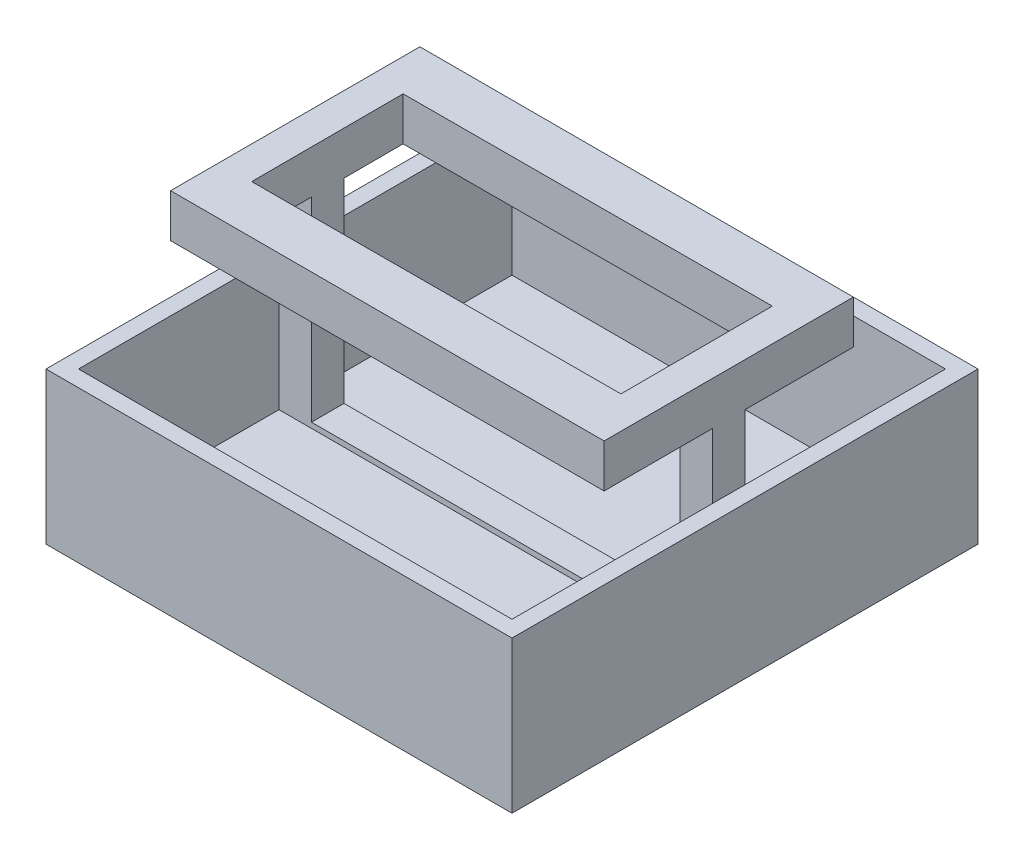
ISO-10303-21;
HEADER;
FILE_DESCRIPTION(('STEP AP214'),'2;1');
FILE_NAME('part.step','',(''),(''),'','','');
FILE_SCHEMA(('AUTOMOTIVE_DESIGN { 1 0 10303 214 1 1 1 1 }'));
ENDSEC;
DATA;
#1=APPLICATION_CONTEXT('core data for automotive mechanical design processes');
#2=APPLICATION_PROTOCOL_DEFINITION('international standard','automotive_design',2000,#1);
#3=PRODUCT_CONTEXT('',#1,'mechanical');
#4=PRODUCT('Part','Part','',(#3));
#5=PRODUCT_RELATED_PRODUCT_CATEGORY('part','',(#4));
#6=PRODUCT_DEFINITION_FORMATION('','',#4);
#7=PRODUCT_DEFINITION_CONTEXT('part definition',#1,'design');
#8=PRODUCT_DEFINITION('design','',#6,#7);
#9=PRODUCT_DEFINITION_SHAPE('','',#8);
#10=(LENGTH_UNIT() NAMED_UNIT(*) SI_UNIT(.MILLI.,.METRE.));
#11=(NAMED_UNIT(*) PLANE_ANGLE_UNIT() SI_UNIT($,.RADIAN.));
#12=(NAMED_UNIT(*) SI_UNIT($,.STERADIAN.) SOLID_ANGLE_UNIT());
#13=UNCERTAINTY_MEASURE_WITH_UNIT(LENGTH_MEASURE(1.E-05),#10,'distance_accuracy_value','');
#14=(GEOMETRIC_REPRESENTATION_CONTEXT(3) GLOBAL_UNCERTAINTY_ASSIGNED_CONTEXT((#13)) GLOBAL_UNIT_ASSIGNED_CONTEXT((#10,
#11,#12)) REPRESENTATION_CONTEXT('',''));
#15=CARTESIAN_POINT('',(0.,0.,0.));
#16=DIRECTION('',(0.,0.,1.));
#17=DIRECTION('',(1.,0.,0.));
#18=AXIS2_PLACEMENT_3D('',#15,#16,#17);
#19=CARTESIAN_POINT('',(10.,7.,0.));
#20=DIRECTION('',(1.,0.,0.));
#21=DIRECTION('',(0.,0.,-1.));
#22=AXIS2_PLACEMENT_3D('',#19,#20,#21);
#23=PLANE('',#22);
#24=DIRECTION('',(0.,-1.,0.));
#25=VECTOR('',#24,1.);
#26=CARTESIAN_POINT('',(10.,12.,0.75));
#27=LINE('',#26,#25);
#28=CARTESIAN_POINT('',(10.,7.,0.75));
#29=VERTEX_POINT('',#28);
#30=CARTESIAN_POINT('',(10.,0.75,0.75));
#31=VERTEX_POINT('',#30);
#32=EDGE_CURVE('E304',#29,#31,#27,.T.);
#33=ORIENTED_EDGE('',*,*,#32,.T.);
#34=DIRECTION('',(0.,0.,1.));
#35=VECTOR('',#34,1.);
#36=CARTESIAN_POINT('',(10.,0.75,0.));
#37=LINE('',#36,#35);
#38=CARTESIAN_POINT('',(10.,0.75,10.));
#39=VERTEX_POINT('',#38);
#40=EDGE_CURVE('E316',#31,#39,#37,.T.);
#41=ORIENTED_EDGE('',*,*,#40,.T.);
#42=DIRECTION('',(0.,-1.,0.));
#43=VECTOR('',#42,1.);
#44=CARTESIAN_POINT('',(10.,7.,10.));
#45=LINE('',#44,#43);
#46=CARTESIAN_POINT('',(10.,7.,10.));
#47=VERTEX_POINT('',#46);
#48=EDGE_CURVE('E371',#47,#39,#45,.T.);
#49=ORIENTED_EDGE('',*,*,#48,.F.);
#50=DIRECTION('',(0.,0.,1.));
#51=VECTOR('',#50,1.);
#52=CARTESIAN_POINT('',(10.,7.,0.));
#53=LINE('',#52,#51);
#54=EDGE_CURVE('E343',#29,#47,#53,.T.);
#55=ORIENTED_EDGE('',*,*,#54,.F.);
#56=EDGE_LOOP('',(#33,#41,#49,#55));
#57=FACE_BOUND('',#56,.T.);
#58=ADVANCED_FACE('F39',(#57),#23,.F.);
#59=CARTESIAN_POINT('',(-9.99999999999999,7.,0.));
#60=DIRECTION('',(1.,0.,0.));
#61=DIRECTION('',(0.,0.,-1.));
#62=AXIS2_PLACEMENT_3D('',#59,#60,#61);
#63=PLANE('',#62);
#64=DIRECTION('',(0.,0.,1.));
#65=VECTOR('',#64,1.);
#66=CARTESIAN_POINT('',(-9.99999999999999,0.75,0.));
#67=LINE('',#66,#65);
#68=CARTESIAN_POINT('',(-9.99999999999999,0.75,0.75));
#69=VERTEX_POINT('',#68);
#70=CARTESIAN_POINT('',(-9.99999999999999,0.75,10.));
#71=VERTEX_POINT('',#70);
#72=EDGE_CURVE('E322',#69,#71,#67,.T.);
#73=ORIENTED_EDGE('',*,*,#72,.F.);
#74=DIRECTION('',(0.,-1.,0.));
#75=VECTOR('',#74,1.);
#76=CARTESIAN_POINT('',(-9.99999999999999,12.,0.75));
#77=LINE('',#76,#75);
#78=CARTESIAN_POINT('',(-9.99999999999999,7.,0.75));
#79=VERTEX_POINT('',#78);
#80=EDGE_CURVE('E307',#79,#69,#77,.T.);
#81=ORIENTED_EDGE('',*,*,#80,.F.);
#82=DIRECTION('',(0.,0.,1.));
#83=VECTOR('',#82,1.);
#84=CARTESIAN_POINT('',(-9.99999999999999,7.,0.));
#85=LINE('',#84,#83);
#86=CARTESIAN_POINT('',(-9.99999999999999,7.,10.));
#87=VERTEX_POINT('',#86);
#88=EDGE_CURVE('E350',#79,#87,#85,.T.);
#89=ORIENTED_EDGE('',*,*,#88,.T.);
#90=DIRECTION('',(0.,-1.,0.));
#91=VECTOR('',#90,1.);
#92=CARTESIAN_POINT('',(-9.99999999999999,7.,10.));
#93=LINE('',#92,#91);
#94=EDGE_CURVE('E367',#87,#71,#93,.T.);
#95=ORIENTED_EDGE('',*,*,#94,.T.);
#96=EDGE_LOOP('',(#73,#81,#89,#95));
#97=FACE_BOUND('',#96,.T.);
#98=ADVANCED_FACE('F440',(#97),#63,.T.);
#99=CARTESIAN_POINT('',(0.,0.75,0.));
#100=DIRECTION('',(0.,1.,0.));
#101=DIRECTION('',(0.,0.,1.));
#102=AXIS2_PLACEMENT_3D('',#99,#100,#101);
#103=PLANE('',#102);
#104=ORIENTED_EDGE('',*,*,#40,.F.);
#105=DIRECTION('',(-1.,0.,0.));
#106=VECTOR('',#105,1.);
#107=CARTESIAN_POINT('',(0.,0.75,0.75));
#108=LINE('',#107,#106);
#109=EDGE_CURVE('E387',#31,#69,#108,.T.);
#110=ORIENTED_EDGE('',*,*,#109,.T.);
#111=ORIENTED_EDGE('',*,*,#72,.T.);
#112=DIRECTION('',(1.,0.,0.));
#113=VECTOR('',#112,1.);
#114=CARTESIAN_POINT('',(0.,0.75,10.));
#115=LINE('',#114,#113);
#116=EDGE_CURVE('E325',#71,#39,#115,.T.);
#117=ORIENTED_EDGE('',*,*,#116,.T.);
#118=EDGE_LOOP('',(#104,#110,#111,#117));
#119=FACE_BOUND('',#118,.T.);
#120=ADVANCED_FACE('F454',(#119),#103,.T.);
#121=CARTESIAN_POINT('',(0.,7.,-10.));
#122=DIRECTION('',(0.,0.,-1.));
#123=DIRECTION('',(-1.,0.,0.));
#124=AXIS2_PLACEMENT_3D('',#121,#122,#123);
#125=PLANE('',#124);
#126=DIRECTION('',(0.,-1.,0.));
#127=VECTOR('',#126,1.);
#128=CARTESIAN_POINT('',(-9.99999999999999,7.,-10.));
#129=LINE('',#128,#127);
#130=CARTESIAN_POINT('',(-9.99999999999999,7.,-10.));
#131=VERTEX_POINT('',#130);
#132=CARTESIAN_POINT('',(-9.99999999999999,0.75,-10.));
#133=VERTEX_POINT('',#132);
#134=EDGE_CURVE('E364',#131,#133,#129,.T.);
#135=ORIENTED_EDGE('',*,*,#134,.T.);
#136=DIRECTION('',(1.,0.,0.));
#137=VECTOR('',#136,1.);
#138=CARTESIAN_POINT('',(0.,0.75,-10.));
#139=LINE('',#138,#137);
#140=CARTESIAN_POINT('',(10.,0.75,-10.));
#141=VERTEX_POINT('',#140);
#142=EDGE_CURVE('E320',#133,#141,#139,.T.);
#143=ORIENTED_EDGE('',*,*,#142,.T.);
#144=DIRECTION('',(0.,-1.,0.));
#145=VECTOR('',#144,1.);
#146=CARTESIAN_POINT('',(10.,7.,-10.));
#147=LINE('',#146,#145);
#148=CARTESIAN_POINT('',(10.,7.,-10.));
#149=VERTEX_POINT('',#148);
#150=EDGE_CURVE('E374',#149,#141,#147,.T.);
#151=ORIENTED_EDGE('',*,*,#150,.F.);
#152=DIRECTION('',(1.,0.,0.));
#153=VECTOR('',#152,1.);
#154=CARTESIAN_POINT('',(0.,7.,-10.));
#155=LINE('',#154,#153);
#156=EDGE_CURVE('E340',#131,#149,#155,.T.);
#157=ORIENTED_EDGE('',*,*,#156,.F.);
#158=EDGE_LOOP('',(#135,#143,#151,#157));
#159=FACE_BOUND('',#158,.T.);
#160=ADVANCED_FACE('F480',(#159),#125,.F.);
#161=CARTESIAN_POINT('',(10.,0.75,-0.75));
#162=VERTEX_POINT('',#161);
#163=EDGE_CURVE('E317',#141,#162,#37,.T.);
#164=ORIENTED_EDGE('',*,*,#163,.T.);
#165=DIRECTION('',(0.,-1.,0.));
#166=VECTOR('',#165,1.);
#167=CARTESIAN_POINT('',(10.,12.,-0.75));
#168=LINE('',#167,#166);
#169=CARTESIAN_POINT('',(10.,7.,-0.75));
#170=VERTEX_POINT('',#169);
#171=EDGE_CURVE('E301',#170,#162,#168,.T.);
#172=ORIENTED_EDGE('',*,*,#171,.F.);
#173=EDGE_CURVE('E344',#149,#170,#53,.T.);
#174=ORIENTED_EDGE('',*,*,#173,.F.);
#175=ORIENTED_EDGE('',*,*,#150,.T.);
#176=EDGE_LOOP('',(#164,#172,#174,#175));
#177=FACE_BOUND('',#176,.T.);
#178=ADVANCED_FACE('F484',(#177),#23,.F.);
#179=CARTESIAN_POINT('',(0.,7.,10.));
#180=DIRECTION('',(0.,0.,-1.));
#181=DIRECTION('',(-1.,0.,0.));
#182=AXIS2_PLACEMENT_3D('',#179,#180,#181);
#183=PLANE('',#182);
#184=ORIENTED_EDGE('',*,*,#116,.F.);
#185=ORIENTED_EDGE('',*,*,#94,.F.);
#186=DIRECTION('',(1.,0.,0.));
#187=VECTOR('',#186,1.);
#188=CARTESIAN_POINT('',(0.,7.,10.));
#189=LINE('',#188,#187);
#190=EDGE_CURVE('E347',#87,#47,#189,.T.);
#191=ORIENTED_EDGE('',*,*,#190,.T.);
#192=ORIENTED_EDGE('',*,*,#48,.T.);
#193=EDGE_LOOP('',(#184,#185,#191,#192));
#194=FACE_BOUND('',#193,.T.);
#195=ADVANCED_FACE('F451',(#194),#183,.T.);
#196=CARTESIAN_POINT('',(0.,7.,-10.75));
#197=DIRECTION('',(0.,0.,-1.));
#198=DIRECTION('',(-1.,0.,0.));
#199=AXIS2_PLACEMENT_3D('',#196,#197,#198);
#200=PLANE('',#199);
#201=DIRECTION('',(1.,0.,0.));
#202=VECTOR('',#201,1.);
#203=CARTESIAN_POINT('',(0.,0.,-10.75));
#204=LINE('',#203,#202);
#205=CARTESIAN_POINT('',(-10.75,0.,-10.75));
#206=VERTEX_POINT('',#205);
#207=CARTESIAN_POINT('',(10.75,0.,-10.75));
#208=VERTEX_POINT('',#207);
#209=EDGE_CURVE('E328',#206,#208,#204,.T.);
#210=ORIENTED_EDGE('',*,*,#209,.F.);
#211=DIRECTION('',(0.,-1.,0.));
#212=VECTOR('',#211,1.);
#213=CARTESIAN_POINT('',(-10.75,7.,-10.75));
#214=LINE('',#213,#212);
#215=CARTESIAN_POINT('',(-10.75,7.,-10.75));
#216=VERTEX_POINT('',#215);
#217=EDGE_CURVE('E368',#216,#206,#214,.T.);
#218=ORIENTED_EDGE('',*,*,#217,.F.);
#219=DIRECTION('',(1.,0.,0.));
#220=VECTOR('',#219,1.);
#221=CARTESIAN_POINT('',(0.,7.,-10.75));
#222=LINE('',#221,#220);
#223=CARTESIAN_POINT('',(10.75,7.,-10.75));
#224=VERTEX_POINT('',#223);
#225=EDGE_CURVE('E329',#216,#224,#222,.T.);
#226=ORIENTED_EDGE('',*,*,#225,.T.);
#227=DIRECTION('',(0.,-1.,0.));
#228=VECTOR('',#227,1.);
#229=CARTESIAN_POINT('',(10.75,7.,-10.75));
#230=LINE('',#229,#228);
#231=EDGE_CURVE('E354',#224,#208,#230,.T.);
#232=ORIENTED_EDGE('',*,*,#231,.T.);
#233=EDGE_LOOP('',(#210,#218,#226,#232));
#234=FACE_BOUND('',#233,.T.);
#235=ADVANCED_FACE('F41',(#234),#200,.T.);
#236=CARTESIAN_POINT('',(-10.75,7.,0.));
#237=DIRECTION('',(1.,0.,0.));
#238=DIRECTION('',(0.,0.,-1.));
#239=AXIS2_PLACEMENT_3D('',#236,#237,#238);
#240=PLANE('',#239);
#241=DIRECTION('',(0.,0.,1.));
#242=VECTOR('',#241,1.);
#243=CARTESIAN_POINT('',(-10.75,0.,0.));
#244=LINE('',#243,#242);
#245=CARTESIAN_POINT('',(-10.75,0.,10.75));
#246=VERTEX_POINT('',#245);
#247=EDGE_CURVE('E357',#206,#246,#244,.T.);
#248=ORIENTED_EDGE('',*,*,#247,.T.);
#249=DIRECTION('',(0.,-1.,0.));
#250=VECTOR('',#249,1.);
#251=CARTESIAN_POINT('',(-10.75,7.,10.75));
#252=LINE('',#251,#250);
#253=CARTESIAN_POINT('',(-10.75,7.,10.75));
#254=VERTEX_POINT('',#253);
#255=EDGE_CURVE('E381',#254,#246,#252,.T.);
#256=ORIENTED_EDGE('',*,*,#255,.F.);
#257=DIRECTION('',(0.,0.,1.));
#258=VECTOR('',#257,1.);
#259=CARTESIAN_POINT('',(-10.75,7.,0.));
#260=LINE('',#259,#258);
#261=EDGE_CURVE('E332',#216,#254,#260,.T.);
#262=ORIENTED_EDGE('',*,*,#261,.F.);
#263=ORIENTED_EDGE('',*,*,#217,.T.);
#264=EDGE_LOOP('',(#248,#256,#262,#263));
#265=FACE_BOUND('',#264,.T.);
#266=ADVANCED_FACE('F522',(#265),#240,.F.);
#267=CARTESIAN_POINT('',(0.,7.,10.75));
#268=DIRECTION('',(0.,0.,-1.));
#269=DIRECTION('',(-1.,0.,0.));
#270=AXIS2_PLACEMENT_3D('',#267,#268,#269);
#271=PLANE('',#270);
#272=DIRECTION('',(1.,0.,0.));
#273=VECTOR('',#272,1.);
#274=CARTESIAN_POINT('',(0.,0.,10.75));
#275=LINE('',#274,#273);
#276=CARTESIAN_POINT('',(10.75,0.,10.75));
#277=VERTEX_POINT('',#276);
#278=EDGE_CURVE('E359',#246,#277,#275,.T.);
#279=ORIENTED_EDGE('',*,*,#278,.T.);
#280=DIRECTION('',(0.,-1.,0.));
#281=VECTOR('',#280,1.);
#282=CARTESIAN_POINT('',(10.75,7.,10.75));
#283=LINE('',#282,#281);
#284=CARTESIAN_POINT('',(10.75,7.,10.75));
#285=VERTEX_POINT('',#284);
#286=EDGE_CURVE('E379',#285,#277,#283,.T.);
#287=ORIENTED_EDGE('',*,*,#286,.F.);
#288=DIRECTION('',(1.,0.,0.));
#289=VECTOR('',#288,1.);
#290=CARTESIAN_POINT('',(0.,7.,10.75));
#291=LINE('',#290,#289);
#292=EDGE_CURVE('E335',#254,#285,#291,.T.);
#293=ORIENTED_EDGE('',*,*,#292,.F.);
#294=ORIENTED_EDGE('',*,*,#255,.T.);
#295=EDGE_LOOP('',(#279,#287,#293,#294));
#296=FACE_BOUND('',#295,.T.);
#297=ADVANCED_FACE('F519',(#296),#271,.F.);
#298=CARTESIAN_POINT('',(10.75,7.,0.));
#299=DIRECTION('',(1.,0.,0.));
#300=DIRECTION('',(0.,0.,-1.));
#301=AXIS2_PLACEMENT_3D('',#298,#299,#300);
#302=PLANE('',#301);
#303=DIRECTION('',(0.,0.,1.));
#304=VECTOR('',#303,1.);
#305=CARTESIAN_POINT('',(10.75,0.,0.));
#306=LINE('',#305,#304);
#307=EDGE_CURVE('E333',#208,#277,#306,.T.);
#308=ORIENTED_EDGE('',*,*,#307,.F.);
#309=ORIENTED_EDGE('',*,*,#231,.F.);
#310=DIRECTION('',(0.,0.,1.));
#311=VECTOR('',#310,1.);
#312=CARTESIAN_POINT('',(10.75,7.,0.));
#313=LINE('',#312,#311);
#314=EDGE_CURVE('E337',#224,#285,#313,.T.);
#315=ORIENTED_EDGE('',*,*,#314,.T.);
#316=ORIENTED_EDGE('',*,*,#286,.T.);
#317=EDGE_LOOP('',(#308,#309,#315,#316));
#318=FACE_BOUND('',#317,.T.);
#319=ADVANCED_FACE('F516',(#318),#302,.T.);
#320=DIRECTION('',(0.,-1.,0.));
#321=VECTOR('',#320,1.);
#322=CARTESIAN_POINT('',(-9.99999999999999,12.,-0.75));
#323=LINE('',#322,#321);
#324=CARTESIAN_POINT('',(-9.99999999999999,7.,-0.75));
#325=VERTEX_POINT('',#324);
#326=CARTESIAN_POINT('',(-9.99999999999999,0.750000000000001,-0.75));
#327=VERTEX_POINT('',#326);
#328=EDGE_CURVE('E298',#325,#327,#323,.T.);
#329=ORIENTED_EDGE('',*,*,#328,.T.);
#330=EDGE_CURVE('E323',#133,#327,#67,.T.);
#331=ORIENTED_EDGE('',*,*,#330,.F.);
#332=ORIENTED_EDGE('',*,*,#134,.F.);
#333=EDGE_CURVE('E351',#131,#325,#85,.T.);
#334=ORIENTED_EDGE('',*,*,#333,.T.);
#335=EDGE_LOOP('',(#329,#331,#332,#334));
#336=FACE_BOUND('',#335,.T.);
#337=ADVANCED_FACE('F476',(#336),#63,.T.);
#338=CARTESIAN_POINT('',(0.,7.,0.));
#339=DIRECTION('',(0.,1.,0.));
#340=DIRECTION('',(0.,0.,1.));
#341=AXIS2_PLACEMENT_3D('',#338,#339,#340);
#342=PLANE('',#341);
#343=ORIENTED_EDGE('',*,*,#225,.F.);
#344=ORIENTED_EDGE('',*,*,#261,.T.);
#345=ORIENTED_EDGE('',*,*,#292,.T.);
#346=ORIENTED_EDGE('',*,*,#314,.F.);
#347=EDGE_LOOP('',(#343,#344,#345,#346));
#348=FACE_BOUND('',#347,.T.);
#349=ORIENTED_EDGE('',*,*,#156,.T.);
#350=ORIENTED_EDGE('',*,*,#173,.T.);
#351=DIRECTION('',(0.,0.,-1.));
#352=VECTOR('',#351,1.);
#353=CARTESIAN_POINT('',(10.,7.,0.));
#354=LINE('',#353,#352);
#355=EDGE_CURVE('E310',#29,#170,#354,.T.);
#356=ORIENTED_EDGE('',*,*,#355,.F.);
#357=ORIENTED_EDGE('',*,*,#54,.T.);
#358=ORIENTED_EDGE('',*,*,#190,.F.);
#359=ORIENTED_EDGE('',*,*,#88,.F.);
#360=DIRECTION('',(0.,0.,-1.));
#361=VECTOR('',#360,1.);
#362=CARTESIAN_POINT('',(-9.99999999999999,7.,0.));
#363=LINE('',#362,#361);
#364=EDGE_CURVE('E313',#79,#325,#363,.T.);
#365=ORIENTED_EDGE('',*,*,#364,.T.);
#366=ORIENTED_EDGE('',*,*,#333,.F.);
#367=EDGE_LOOP('',(#349,#350,#356,#357,#358,#359,#365,#366));
#368=FACE_BOUND('',#367,.T.);
#369=ADVANCED_FACE('F444',(#348,#368),#342,.T.);
#370=CARTESIAN_POINT('',(0.,0.,0.));
#371=DIRECTION('',(0.,1.,0.));
#372=DIRECTION('',(0.,0.,1.));
#373=AXIS2_PLACEMENT_3D('',#370,#371,#372);
#374=PLANE('',#373);
#375=ORIENTED_EDGE('',*,*,#209,.T.);
#376=ORIENTED_EDGE('',*,*,#307,.T.);
#377=ORIENTED_EDGE('',*,*,#278,.F.);
#378=ORIENTED_EDGE('',*,*,#247,.F.);
#379=EDGE_LOOP('',(#375,#376,#377,#378));
#380=FACE_BOUND('',#379,.T.);
#381=ADVANCED_FACE('F489',(#380),#374,.F.);
#382=DIRECTION('',(-1.,0.,0.));
#383=VECTOR('',#382,1.);
#384=CARTESIAN_POINT('',(0.,0.75,-0.75));
#385=LINE('',#384,#383);
#386=EDGE_CURVE('E377',#162,#327,#385,.T.);
#387=ORIENTED_EDGE('',*,*,#386,.F.);
#388=ORIENTED_EDGE('',*,*,#163,.F.);
#389=ORIENTED_EDGE('',*,*,#142,.F.);
#390=ORIENTED_EDGE('',*,*,#330,.T.);
#391=EDGE_LOOP('',(#387,#388,#389,#390));
#392=FACE_BOUND('',#391,.T.);
#393=ADVANCED_FACE('F487',(#392),#103,.T.);
#394=CARTESIAN_POINT('',(-9.99999999999999,12.,0.));
#395=DIRECTION('',(1.,0.,0.));
#396=DIRECTION('',(0.,0.,-1.));
#397=AXIS2_PLACEMENT_3D('',#394,#395,#396);
#398=PLANE('',#397);
#399=CARTESIAN_POINT('',(-9.99999999999999,10.,0.750000000000002));
#400=VERTEX_POINT('',#399);
#401=EDGE_CURVE('E308',#400,#79,#77,.T.);
#402=ORIENTED_EDGE('',*,*,#401,.F.);
#403=DIRECTION('',(0.,0.,-1.));
#404=VECTOR('',#403,1.);
#405=CARTESIAN_POINT('',(-9.99999999999999,10.,5.75));
#406=LINE('',#405,#404);
#407=CARTESIAN_POINT('',(-9.99999999999999,10.,5.75));
#408=VERTEX_POINT('',#407);
#409=EDGE_CURVE('E283',#408,#400,#406,.T.);
#410=ORIENTED_EDGE('',*,*,#409,.F.);
#411=DIRECTION('',(0.,1.,0.));
#412=VECTOR('',#411,1.);
#413=CARTESIAN_POINT('',(-9.99999999999999,12.,5.75));
#414=LINE('',#413,#412);
#415=CARTESIAN_POINT('',(-9.99999999999999,12.,5.75));
#416=VERTEX_POINT('',#415);
#417=EDGE_CURVE('E270',#408,#416,#414,.T.);
#418=ORIENTED_EDGE('',*,*,#417,.T.);
#419=DIRECTION('',(0.,0.,1.));
#420=VECTOR('',#419,1.);
#421=CARTESIAN_POINT('',(-9.99999999999999,12.,0.));
#422=LINE('',#421,#420);
#423=CARTESIAN_POINT('',(-9.99999999999999,12.,-5.75));
#424=VERTEX_POINT('',#423);
#425=EDGE_CURVE('E294',#424,#416,#422,.T.);
#426=ORIENTED_EDGE('',*,*,#425,.F.);
#427=DIRECTION('',(0.,1.,0.));
#428=VECTOR('',#427,1.);
#429=CARTESIAN_POINT('',(-9.99999999999999,12.,-5.75));
#430=LINE('',#429,#428);
#431=CARTESIAN_POINT('',(-9.99999999999999,10.,-5.75));
#432=VERTEX_POINT('',#431);
#433=EDGE_CURVE('E258',#432,#424,#430,.T.);
#434=ORIENTED_EDGE('',*,*,#433,.F.);
#435=CARTESIAN_POINT('',(-9.99999999999999,10.,-0.75));
#436=VERTEX_POINT('',#435);
#437=EDGE_CURVE('E287',#436,#432,#406,.T.);
#438=ORIENTED_EDGE('',*,*,#437,.F.);
#439=EDGE_CURVE('E299',#436,#325,#323,.T.);
#440=ORIENTED_EDGE('',*,*,#439,.T.);
#441=ORIENTED_EDGE('',*,*,#364,.F.);
#442=EDGE_LOOP('',(#402,#410,#418,#426,#434,#438,#440,#441));
#443=FACE_BOUND('',#442,.T.);
#444=ADVANCED_FACE('F433',(#443),#398,.F.);
#445=CARTESIAN_POINT('',(0.,12.,0.75));
#446=DIRECTION('',(0.,0.,-1.));
#447=DIRECTION('',(-1.,0.,0.));
#448=AXIS2_PLACEMENT_3D('',#445,#446,#447);
#449=PLANE('',#448);
#450=DIRECTION('',(1.,0.,0.));
#451=VECTOR('',#450,1.);
#452=CARTESIAN_POINT('',(0.,1.,0.75));
#453=LINE('',#452,#451);
#454=CARTESIAN_POINT('',(-8.49850164500981,1.,0.75));
#455=VERTEX_POINT('',#454);
#456=CARTESIAN_POINT('',(8.50156946421205,1.,0.75));
#457=VERTEX_POINT('',#456);
#458=EDGE_CURVE('E256',#455,#457,#453,.T.);
#459=ORIENTED_EDGE('',*,*,#458,.F.);
#460=DIRECTION('',(0.,1.,0.));
#461=VECTOR('',#460,1.);
#462=CARTESIAN_POINT('',(-8.49850164500981,12.,0.75));
#463=LINE('',#462,#461);
#464=CARTESIAN_POINT('',(-8.49850164500981,10.,0.750000000000002));
#465=VERTEX_POINT('',#464);
#466=EDGE_CURVE('E249',#455,#465,#463,.T.);
#467=ORIENTED_EDGE('',*,*,#466,.T.);
#468=DIRECTION('',(-1.,0.,0.));
#469=VECTOR('',#468,1.);
#470=CARTESIAN_POINT('',(0.,10.,0.75));
#471=LINE('',#470,#469);
#472=EDGE_CURVE('E286',#465,#400,#471,.T.);
#473=ORIENTED_EDGE('',*,*,#472,.T.);
#474=ORIENTED_EDGE('',*,*,#401,.T.);
#475=ORIENTED_EDGE('',*,*,#80,.T.);
#476=ORIENTED_EDGE('',*,*,#109,.F.);
#477=ORIENTED_EDGE('',*,*,#32,.F.);
#478=CARTESIAN_POINT('',(10.,10.,0.750000000000002));
#479=VERTEX_POINT('',#478);
#480=EDGE_CURVE('E305',#479,#29,#27,.T.);
#481=ORIENTED_EDGE('',*,*,#480,.F.);
#482=CARTESIAN_POINT('',(8.50156946421205,10.,0.750000000000002));
#483=VERTEX_POINT('',#482);
#484=EDGE_CURVE('E291',#479,#483,#471,.T.);
#485=ORIENTED_EDGE('',*,*,#484,.T.);
#486=DIRECTION('',(0.,-1.,0.));
#487=VECTOR('',#486,1.);
#488=CARTESIAN_POINT('',(8.50156946421205,12.,0.75));
#489=LINE('',#488,#487);
#490=EDGE_CURVE('E239',#483,#457,#489,.T.);
#491=ORIENTED_EDGE('',*,*,#490,.T.);
#492=EDGE_LOOP('',(#459,#467,#473,#474,#475,#476,#477,#481,#485,#491));
#493=FACE_BOUND('',#492,.T.);
#494=ADVANCED_FACE('F425',(#493),#449,.F.);
#495=CARTESIAN_POINT('',(10.,12.,0.));
#496=DIRECTION('',(1.,0.,0.));
#497=DIRECTION('',(0.,0.,-1.));
#498=AXIS2_PLACEMENT_3D('',#495,#496,#497);
#499=PLANE('',#498);
#500=CARTESIAN_POINT('',(10.,10.,-0.75));
#501=VERTEX_POINT('',#500);
#502=EDGE_CURVE('E302',#501,#170,#168,.T.);
#503=ORIENTED_EDGE('',*,*,#502,.F.);
#504=DIRECTION('',(0.,0.,-1.));
#505=VECTOR('',#504,1.);
#506=CARTESIAN_POINT('',(10.,10.,5.75));
#507=LINE('',#506,#505);
#508=CARTESIAN_POINT('',(10.,10.,-5.75));
#509=VERTEX_POINT('',#508);
#510=EDGE_CURVE('E282',#501,#509,#507,.T.);
#511=ORIENTED_EDGE('',*,*,#510,.T.);
#512=DIRECTION('',(0.,-1.,0.));
#513=VECTOR('',#512,1.);
#514=CARTESIAN_POINT('',(10.,12.,-5.75));
#515=LINE('',#514,#513);
#516=CARTESIAN_POINT('',(10.,12.,-5.75));
#517=VERTEX_POINT('',#516);
#518=EDGE_CURVE('E264',#517,#509,#515,.T.);
#519=ORIENTED_EDGE('',*,*,#518,.F.);
#520=DIRECTION('',(0.,0.,1.));
#521=VECTOR('',#520,1.);
#522=CARTESIAN_POINT('',(10.,12.,0.));
#523=LINE('',#522,#521);
#524=CARTESIAN_POINT('',(10.,12.,5.75));
#525=VERTEX_POINT('',#524);
#526=EDGE_CURVE('E296',#517,#525,#523,.T.);
#527=ORIENTED_EDGE('',*,*,#526,.T.);
#528=DIRECTION('',(0.,-1.,0.));
#529=VECTOR('',#528,1.);
#530=CARTESIAN_POINT('',(10.,12.,5.75));
#531=LINE('',#530,#529);
#532=CARTESIAN_POINT('',(10.,10.,5.75));
#533=VERTEX_POINT('',#532);
#534=EDGE_CURVE('E276',#525,#533,#531,.T.);
#535=ORIENTED_EDGE('',*,*,#534,.T.);
#536=EDGE_CURVE('E288',#533,#479,#507,.T.);
#537=ORIENTED_EDGE('',*,*,#536,.T.);
#538=ORIENTED_EDGE('',*,*,#480,.T.);
#539=ORIENTED_EDGE('',*,*,#355,.T.);
#540=EDGE_LOOP('',(#503,#511,#519,#527,#535,#537,#538,#539));
#541=FACE_BOUND('',#540,.T.);
#542=ADVANCED_FACE('F459',(#541),#499,.T.);
#543=CARTESIAN_POINT('',(0.,12.,-0.75));
#544=DIRECTION('',(0.,0.,-1.));
#545=DIRECTION('',(-1.,0.,0.));
#546=AXIS2_PLACEMENT_3D('',#543,#544,#545);
#547=PLANE('',#546);
#548=DIRECTION('',(0.,1.,0.));
#549=VECTOR('',#548,1.);
#550=CARTESIAN_POINT('',(-8.50156946421205,12.,-0.75));
#551=LINE('',#550,#549);
#552=CARTESIAN_POINT('',(-8.50156946421206,1.,-0.75));
#553=VERTEX_POINT('',#552);
#554=CARTESIAN_POINT('',(-8.50156946421206,10.,-0.749999999999998));
#555=VERTEX_POINT('',#554);
#556=EDGE_CURVE('E254',#553,#555,#551,.T.);
#557=ORIENTED_EDGE('',*,*,#556,.F.);
#558=DIRECTION('',(1.,0.,0.));
#559=VECTOR('',#558,1.);
#560=CARTESIAN_POINT('',(0.,1.,-0.75));
#561=LINE('',#560,#559);
#562=CARTESIAN_POINT('',(8.4985016450098,1.,-0.75));
#563=VERTEX_POINT('',#562);
#564=EDGE_CURVE('E11',#553,#563,#561,.T.);
#565=ORIENTED_EDGE('',*,*,#564,.T.);
#566=DIRECTION('',(0.,-1.,0.));
#567=VECTOR('',#566,1.);
#568=CARTESIAN_POINT('',(8.4985016450098,12.,-0.75));
#569=LINE('',#568,#567);
#570=CARTESIAN_POINT('',(8.4985016450098,10.,-0.749999999999998));
#571=VERTEX_POINT('',#570);
#572=EDGE_CURVE('E247',#571,#563,#569,.T.);
#573=ORIENTED_EDGE('',*,*,#572,.F.);
#574=DIRECTION('',(-1.,0.,0.));
#575=VECTOR('',#574,1.);
#576=CARTESIAN_POINT('',(0.,10.,-0.75));
#577=LINE('',#576,#575);
#578=EDGE_CURVE('E390',#501,#571,#577,.T.);
#579=ORIENTED_EDGE('',*,*,#578,.F.);
#580=ORIENTED_EDGE('',*,*,#502,.T.);
#581=ORIENTED_EDGE('',*,*,#171,.T.);
#582=ORIENTED_EDGE('',*,*,#386,.T.);
#583=ORIENTED_EDGE('',*,*,#328,.F.);
#584=ORIENTED_EDGE('',*,*,#439,.F.);
#585=EDGE_CURVE('E389',#555,#436,#577,.T.);
#586=ORIENTED_EDGE('',*,*,#585,.F.);
#587=EDGE_LOOP('',(#557,#565,#573,#579,#580,#581,#582,#583,#584,#586));
#588=FACE_BOUND('',#587,.T.);
#589=ADVANCED_FACE('F411',(#588),#547,.T.);
#590=CARTESIAN_POINT('',(0.,12.,0.));
#591=DIRECTION('',(0.,1.,0.));
#592=DIRECTION('',(0.,0.,1.));
#593=AXIS2_PLACEMENT_3D('',#590,#591,#592);
#594=PLANE('',#593);
#595=DIRECTION('',(0.00204520852405632,0.,0.999997908558859));
#596=VECTOR('',#595,1.);
#597=CARTESIAN_POINT('',(-8.50715824480525,12.,-3.48261569118726));
#598=LINE('',#597,#596);
#599=CARTESIAN_POINT('',(-8.50715824480525,12.,-3.48261569118726));
#600=VERTEX_POINT('',#599);
#601=CARTESIAN_POINT('',(-8.49284175519476,12.,3.51738430881274));
#602=VERTEX_POINT('',#601);
#603=EDGE_CURVE('E54',#600,#602,#598,.T.);
#604=ORIENTED_EDGE('',*,*,#603,.F.);
#605=DIRECTION('',(-0.99999790855886,0.,0.00204520852405624));
#606=VECTOR('',#605,1.);
#607=CARTESIAN_POINT('',(-8.50715824480525,12.,-3.48261569118726));
#608=LINE('',#607,#606);
#609=CARTESIAN_POINT('',(8.49284175519476,12.,-3.51738430881274));
#610=VERTEX_POINT('',#609);
#611=EDGE_CURVE('E231',#610,#600,#608,.T.);
#612=ORIENTED_EDGE('',*,*,#611,.F.);
#613=DIRECTION('',(-0.00204520852405632,0.,-0.999997908558859));
#614=VECTOR('',#613,1.);
#615=CARTESIAN_POINT('',(8.49284175519476,12.,-3.51738430881274));
#616=LINE('',#615,#614);
#617=CARTESIAN_POINT('',(8.50715824480524,12.,3.48261569118726));
#618=VERTEX_POINT('',#617);
#619=EDGE_CURVE('E215',#618,#610,#616,.T.);
#620=ORIENTED_EDGE('',*,*,#619,.F.);
#621=DIRECTION('',(0.99999790855886,0.,-0.00204520852405624));
#622=VECTOR('',#621,1.);
#623=CARTESIAN_POINT('',(-8.49284175519476,12.,3.51738430881274));
#624=LINE('',#623,#622);
#625=EDGE_CURVE('E224',#602,#618,#624,.T.);
#626=ORIENTED_EDGE('',*,*,#625,.F.);
#627=EDGE_LOOP('',(#604,#612,#620,#626));
#628=FACE_BOUND('',#627,.T.);
#629=ORIENTED_EDGE('',*,*,#425,.T.);
#630=DIRECTION('',(1.,0.,0.));
#631=VECTOR('',#630,1.);
#632=CARTESIAN_POINT('',(10.,12.,5.75));
#633=LINE('',#632,#631);
#634=EDGE_CURVE('E273',#416,#525,#633,.T.);
#635=ORIENTED_EDGE('',*,*,#634,.T.);
#636=ORIENTED_EDGE('',*,*,#526,.F.);
#637=DIRECTION('',(1.,0.,0.));
#638=VECTOR('',#637,1.);
#639=CARTESIAN_POINT('',(10.,12.,-5.75));
#640=LINE('',#639,#638);
#641=EDGE_CURVE('E261',#424,#517,#640,.T.);
#642=ORIENTED_EDGE('',*,*,#641,.F.);
#643=EDGE_LOOP('',(#629,#635,#636,#642));
#644=FACE_BOUND('',#643,.T.);
#645=ADVANCED_FACE('F228',(#628,#644),#594,.T.);
#646=CARTESIAN_POINT('',(0.,0.,-5.75));
#647=DIRECTION('',(0.,0.,-1.));
#648=DIRECTION('',(-1.,0.,0.));
#649=AXIS2_PLACEMENT_3D('',#646,#647,#648);
#650=PLANE('',#649);
#651=ORIENTED_EDGE('',*,*,#433,.T.);
#652=ORIENTED_EDGE('',*,*,#641,.T.);
#653=ORIENTED_EDGE('',*,*,#518,.T.);
#654=DIRECTION('',(-1.,0.,0.));
#655=VECTOR('',#654,1.);
#656=CARTESIAN_POINT('',(10.,10.,-5.75));
#657=LINE('',#656,#655);
#658=EDGE_CURVE('E267',#509,#432,#657,.T.);
#659=ORIENTED_EDGE('',*,*,#658,.T.);
#660=EDGE_LOOP('',(#651,#652,#653,#659));
#661=FACE_BOUND('',#660,.T.);
#662=ADVANCED_FACE('F469',(#661),#650,.T.);
#663=CARTESIAN_POINT('',(10.,10.,5.75));
#664=DIRECTION('',(0.,-1.,0.));
#665=DIRECTION('',(0.,0.,-1.));
#666=AXIS2_PLACEMENT_3D('',#663,#664,#665);
#667=PLANE('',#666);
#668=DIRECTION('',(-0.00204520852405632,0.,-0.99999790855886));
#669=VECTOR('',#668,1.);
#670=CARTESIAN_POINT('',(-8.48819824680285,10.,5.787812299731));
#671=LINE('',#670,#669);
#672=CARTESIAN_POINT('',(-8.50715824480525,10.,-3.48261569118726));
#673=VERTEX_POINT('',#672);
#674=EDGE_CURVE('E252',#555,#673,#671,.T.);
#675=ORIENTED_EDGE('',*,*,#674,.F.);
#676=ORIENTED_EDGE('',*,*,#585,.T.);
#677=ORIENTED_EDGE('',*,*,#437,.T.);
#678=ORIENTED_EDGE('',*,*,#658,.F.);
#679=ORIENTED_EDGE('',*,*,#510,.F.);
#680=ORIENTED_EDGE('',*,*,#578,.T.);
#681=DIRECTION('',(0.00204520852405632,0.,0.99999790855886));
#682=VECTOR('',#681,1.);
#683=CARTESIAN_POINT('',(8.51180175319715,10.,5.75304368210553));
#684=LINE('',#683,#682);
#685=CARTESIAN_POINT('',(8.49284175519476,10.,-3.51738430881274));
#686=VERTEX_POINT('',#685);
#687=EDGE_CURVE('E245',#686,#571,#684,.T.);
#688=ORIENTED_EDGE('',*,*,#687,.F.);
#689=DIRECTION('',(0.99999790855886,0.,-0.00204520852405625));
#690=VECTOR('',#689,1.);
#691=CARTESIAN_POINT('',(9.98104000199761,10.,-3.52042799091827));
#692=LINE('',#691,#690);
#693=EDGE_CURVE('E47',#673,#686,#692,.T.);
#694=ORIENTED_EDGE('',*,*,#693,.F.);
#695=EDGE_LOOP('',(#675,#676,#677,#678,#679,#680,#688,#694));
#696=FACE_BOUND('',#695,.T.);
#697=ADVANCED_FACE('F404',(#696),#667,.T.);
#698=DIRECTION('',(-0.00204520852405632,0.,-0.99999790855886));
#699=VECTOR('',#698,1.);
#700=CARTESIAN_POINT('',(-8.48819824680285,10.,5.787812299731));
#701=LINE('',#700,#699);
#702=CARTESIAN_POINT('',(-8.49284175519476,10.,3.51738430881274));
#703=VERTEX_POINT('',#702);
#704=EDGE_CURVE('E396',#703,#465,#701,.T.);
#705=ORIENTED_EDGE('',*,*,#704,.F.);
#706=DIRECTION('',(-0.99999790855886,0.,0.00204520852405625));
#707=VECTOR('',#706,1.);
#708=CARTESIAN_POINT('',(9.9953564916081,10.,3.47957200908174));
#709=LINE('',#708,#707);
#710=CARTESIAN_POINT('',(8.50715824480524,10.,3.48261569118726));
#711=VERTEX_POINT('',#710);
#712=EDGE_CURVE('E393',#711,#703,#709,.T.);
#713=ORIENTED_EDGE('',*,*,#712,.F.);
#714=DIRECTION('',(0.00204520852405632,0.,0.99999790855886));
#715=VECTOR('',#714,1.);
#716=CARTESIAN_POINT('',(8.51180175319715,10.,5.75304368210553));
#717=LINE('',#716,#715);
#718=EDGE_CURVE('E218',#483,#711,#717,.T.);
#719=ORIENTED_EDGE('',*,*,#718,.F.);
#720=ORIENTED_EDGE('',*,*,#484,.F.);
#721=ORIENTED_EDGE('',*,*,#536,.F.);
#722=DIRECTION('',(-1.,0.,0.));
#723=VECTOR('',#722,1.);
#724=CARTESIAN_POINT('',(10.,10.,5.75));
#725=LINE('',#724,#723);
#726=EDGE_CURVE('E279',#533,#408,#725,.T.);
#727=ORIENTED_EDGE('',*,*,#726,.T.);
#728=ORIENTED_EDGE('',*,*,#409,.T.);
#729=ORIENTED_EDGE('',*,*,#472,.F.);
#730=EDGE_LOOP('',(#705,#713,#719,#720,#721,#727,#728,#729));
#731=FACE_BOUND('',#730,.T.);
#732=ADVANCED_FACE('F427',(#731),#667,.T.);
#733=CARTESIAN_POINT('',(0.,0.,5.75));
#734=DIRECTION('',(0.,0.,-1.));
#735=DIRECTION('',(-1.,0.,0.));
#736=AXIS2_PLACEMENT_3D('',#733,#734,#735);
#737=PLANE('',#736);
#738=ORIENTED_EDGE('',*,*,#417,.F.);
#739=ORIENTED_EDGE('',*,*,#726,.F.);
#740=ORIENTED_EDGE('',*,*,#534,.F.);
#741=ORIENTED_EDGE('',*,*,#634,.F.);
#742=EDGE_LOOP('',(#738,#739,#740,#741));
#743=FACE_BOUND('',#742,.T.);
#744=ADVANCED_FACE('F464',(#743),#737,.F.);
#745=CARTESIAN_POINT('',(0.,1.,0.));
#746=DIRECTION('',(0.,1.,0.));
#747=DIRECTION('',(0.,0.,1.));
#748=AXIS2_PLACEMENT_3D('',#745,#746,#747);
#749=PLANE('',#748);
#750=ORIENTED_EDGE('',*,*,#458,.T.);
#751=DIRECTION('',(-0.00204520852405632,0.,-0.999997908558859));
#752=VECTOR('',#751,1.);
#753=CARTESIAN_POINT('',(8.49284175519476,1.,-3.51738430881274));
#754=LINE('',#753,#752);
#755=EDGE_CURVE('E242',#457,#563,#754,.T.);
#756=ORIENTED_EDGE('',*,*,#755,.T.);
#757=ORIENTED_EDGE('',*,*,#564,.F.);
#758=DIRECTION('',(0.00204520852405632,0.,0.999997908558859));
#759=VECTOR('',#758,1.);
#760=CARTESIAN_POINT('',(-8.50715824480525,1.,-3.48261569118726));
#761=LINE('',#760,#759);
#762=EDGE_CURVE('E233',#553,#455,#761,.T.);
#763=ORIENTED_EDGE('',*,*,#762,.T.);
#764=EDGE_LOOP('',(#750,#756,#757,#763));
#765=FACE_BOUND('',#764,.T.);
#766=ADVANCED_FACE('F417',(#765),#749,.T.);
#767=CARTESIAN_POINT('',(-8.50715824480525,1.,-3.48261569118726));
#768=DIRECTION('',(-0.99999790855886,0.,0.00204520852405632));
#769=DIRECTION('',(0.00204520852405632,0.,0.99999790855886));
#770=AXIS2_PLACEMENT_3D('',#767,#768,#769);
#771=PLANE('',#770);
#772=ORIENTED_EDGE('',*,*,#556,.T.);
#773=ORIENTED_EDGE('',*,*,#674,.T.);
#774=DIRECTION('',(0.,1.,0.));
#775=VECTOR('',#774,1.);
#776=CARTESIAN_POINT('',(-8.50715824480525,1.,-3.48261569118726));
#777=LINE('',#776,#775);
#778=EDGE_CURVE('E237',#673,#600,#777,.T.);
#779=ORIENTED_EDGE('',*,*,#778,.T.);
#780=ORIENTED_EDGE('',*,*,#603,.T.);
#781=DIRECTION('',(0.,1.,0.));
#782=VECTOR('',#781,1.);
#783=CARTESIAN_POINT('',(-8.49284175519476,1.,3.51738430881274));
#784=LINE('',#783,#782);
#785=EDGE_CURVE('E221',#703,#602,#784,.T.);
#786=ORIENTED_EDGE('',*,*,#785,.F.);
#787=ORIENTED_EDGE('',*,*,#704,.T.);
#788=ORIENTED_EDGE('',*,*,#466,.F.);
#789=ORIENTED_EDGE('',*,*,#762,.F.);
#790=EDGE_LOOP('',(#772,#773,#779,#780,#786,#787,#788,#789));
#791=FACE_BOUND('',#790,.T.);
#792=ADVANCED_FACE('F419',(#791),#771,.F.);
#793=CARTESIAN_POINT('',(8.49284175519476,1.,-3.51738430881274));
#794=DIRECTION('',(0.99999790855886,0.,-0.00204520852405632));
#795=DIRECTION('',(-0.00204520852405632,0.,-0.99999790855886));
#796=AXIS2_PLACEMENT_3D('',#793,#794,#795);
#797=PLANE('',#796);
#798=ORIENTED_EDGE('',*,*,#572,.T.);
#799=ORIENTED_EDGE('',*,*,#755,.F.);
#800=ORIENTED_EDGE('',*,*,#490,.F.);
#801=ORIENTED_EDGE('',*,*,#718,.T.);
#802=DIRECTION('',(0.,1.,0.));
#803=VECTOR('',#802,1.);
#804=CARTESIAN_POINT('',(8.50715824480524,1.,3.48261569118726));
#805=LINE('',#804,#803);
#806=EDGE_CURVE('E211',#711,#618,#805,.T.);
#807=ORIENTED_EDGE('',*,*,#806,.T.);
#808=ORIENTED_EDGE('',*,*,#619,.T.);
#809=DIRECTION('',(0.,1.,0.));
#810=VECTOR('',#809,1.);
#811=CARTESIAN_POINT('',(8.49284175519476,1.,-3.51738430881274));
#812=LINE('',#811,#810);
#813=EDGE_CURVE('E62',#686,#610,#812,.T.);
#814=ORIENTED_EDGE('',*,*,#813,.F.);
#815=ORIENTED_EDGE('',*,*,#687,.T.);
#816=EDGE_LOOP('',(#798,#799,#800,#801,#807,#808,#814,#815));
#817=FACE_BOUND('',#816,.T.);
#818=ADVANCED_FACE('F213',(#817),#797,.F.);
#819=CARTESIAN_POINT('',(-8.50715824480525,1.,-3.48261569118726));
#820=DIRECTION('',(-0.00204520852405624,0.,-0.99999790855886));
#821=DIRECTION('',(-0.99999790855886,0.,0.00204520852405624));
#822=AXIS2_PLACEMENT_3D('',#819,#820,#821);
#823=PLANE('',#822);
#824=ORIENTED_EDGE('',*,*,#693,.T.);
#825=ORIENTED_EDGE('',*,*,#813,.T.);
#826=ORIENTED_EDGE('',*,*,#611,.T.);
#827=ORIENTED_EDGE('',*,*,#778,.F.);
#828=EDGE_LOOP('',(#824,#825,#826,#827));
#829=FACE_BOUND('',#828,.T.);
#830=ADVANCED_FACE('F401',(#829),#823,.F.);
#831=CARTESIAN_POINT('',(-8.49284175519476,1.,3.51738430881274));
#832=DIRECTION('',(0.00204520852405624,0.,0.99999790855886));
#833=DIRECTION('',(0.99999790855886,0.,-0.00204520852405624));
#834=AXIS2_PLACEMENT_3D('',#831,#832,#833);
#835=PLANE('',#834);
#836=ORIENTED_EDGE('',*,*,#712,.T.);
#837=ORIENTED_EDGE('',*,*,#785,.T.);
#838=ORIENTED_EDGE('',*,*,#625,.T.);
#839=ORIENTED_EDGE('',*,*,#806,.F.);
#840=EDGE_LOOP('',(#836,#837,#838,#839));
#841=FACE_BOUND('',#840,.T.);
#842=ADVANCED_FACE('F225',(#841),#835,.F.);
#843=CLOSED_SHELL('',(#58,#98,#120,#160,#178,#195,#235,#266,#297,#319,#337,#369,#381,#393,#444,
#494,#542,#589,#645,#662,#697,#732,#744,#766,#792,#818,#830,#842));
#844=MANIFOLD_SOLID_BREP('B2',#843);
#845=ADVANCED_BREP_SHAPE_REPRESENTATION('',(#18,#844),#14);
#846=SHAPE_DEFINITION_REPRESENTATION(#9,#845);
ENDSEC;
END-ISO-10303-21;
